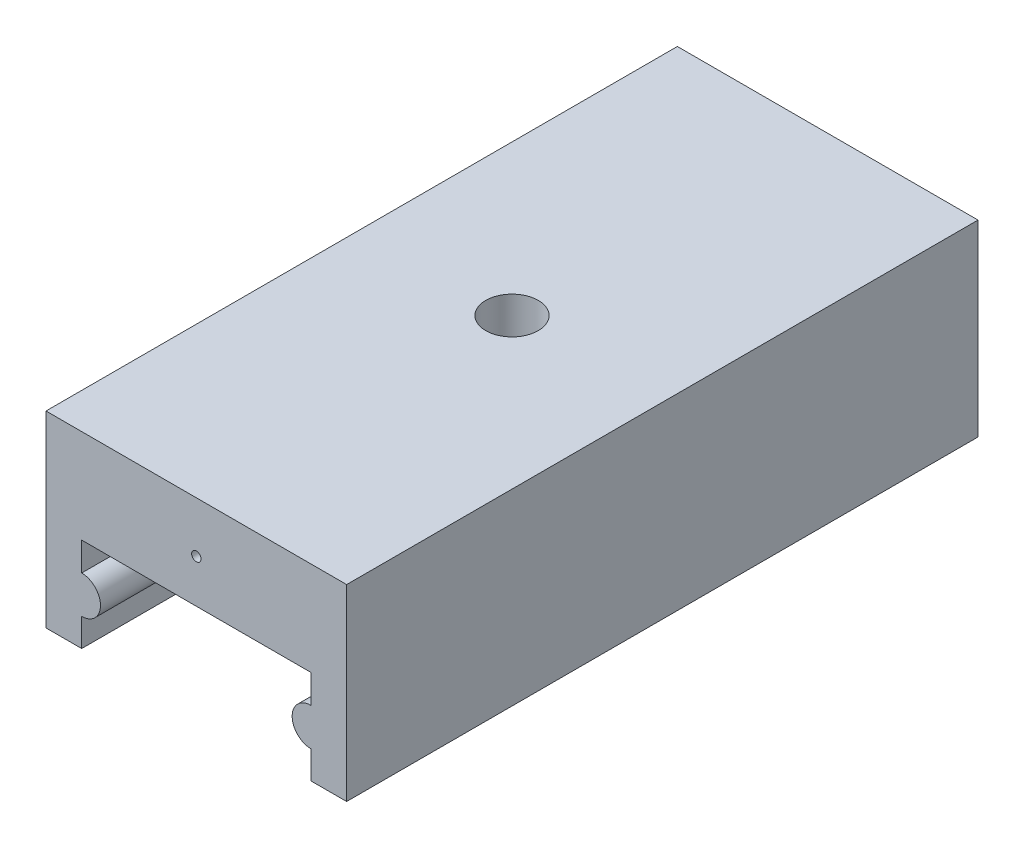
ISO-10303-21;
HEADER;
FILE_DESCRIPTION(('STEP AP214'),'2;1');
FILE_NAME('part.step','',(''),(''),'','','');
FILE_SCHEMA(('AUTOMOTIVE_DESIGN { 1 0 10303 214 1 1 1 1 }'));
ENDSEC;
DATA;
#1=APPLICATION_CONTEXT('core data for automotive mechanical design processes');
#2=APPLICATION_PROTOCOL_DEFINITION('international standard','automotive_design',2000,#1);
#3=PRODUCT_CONTEXT('',#1,'mechanical');
#4=PRODUCT('Part','Part','',(#3));
#5=PRODUCT_RELATED_PRODUCT_CATEGORY('part','',(#4));
#6=PRODUCT_DEFINITION_FORMATION('','',#4);
#7=PRODUCT_DEFINITION_CONTEXT('part definition',#1,'design');
#8=PRODUCT_DEFINITION('design','',#6,#7);
#9=PRODUCT_DEFINITION_SHAPE('','',#8);
#10=(LENGTH_UNIT() NAMED_UNIT(*) SI_UNIT(.MILLI.,.METRE.));
#11=(NAMED_UNIT(*) PLANE_ANGLE_UNIT() SI_UNIT($,.RADIAN.));
#12=(NAMED_UNIT(*) SI_UNIT($,.STERADIAN.) SOLID_ANGLE_UNIT());
#13=UNCERTAINTY_MEASURE_WITH_UNIT(LENGTH_MEASURE(1.E-05),#10,'distance_accuracy_value','');
#14=(GEOMETRIC_REPRESENTATION_CONTEXT(3) GLOBAL_UNCERTAINTY_ASSIGNED_CONTEXT((#13)) GLOBAL_UNIT_ASSIGNED_CONTEXT((#10,
#11,#12)) REPRESENTATION_CONTEXT('',''));
#15=CARTESIAN_POINT('',(0.,0.,0.));
#16=DIRECTION('',(0.,0.,1.));
#17=DIRECTION('',(1.,0.,0.));
#18=AXIS2_PLACEMENT_3D('',#15,#16,#17);
#19=CARTESIAN_POINT('',(-13.,13.,-16.8));
#20=DIRECTION('',(0.,-1.,0.));
#21=DIRECTION('',(-1.,0.,0.));
#22=AXIS2_PLACEMENT_3D('',#19,#20,#21);
#23=PLANE('',#22);
#24=CARTESIAN_POINT('',(0.,13.,0.));
#25=DIRECTION('',(0.,-1.,0.));
#26=DIRECTION('',(0.,0.,-1.));
#27=AXIS2_PLACEMENT_3D('',#24,#25,#26);
#28=CIRCLE('',#27,1.397);
#29=CARTESIAN_POINT('',(0.,13.,-1.397));
#30=VERTEX_POINT('',#29);
#31=EDGE_CURVE('E170',#30,#30,#28,.T.);
#32=ORIENTED_EDGE('',*,*,#31,.T.);
#33=EDGE_LOOP('',(#32));
#34=FACE_BOUND('',#33,.T.);
#35=DIRECTION('',(-1.,0.,0.));
#36=VECTOR('',#35,1.);
#37=CARTESIAN_POINT('',(-7.99999999999997,13.,16.8));
#38=LINE('',#37,#36);
#39=CARTESIAN_POINT('',(8.,13.,16.8));
#40=VERTEX_POINT('',#39);
#41=CARTESIAN_POINT('',(-7.99999999999997,13.,16.8));
#42=VERTEX_POINT('',#41);
#43=EDGE_CURVE('E160',#40,#42,#38,.T.);
#44=ORIENTED_EDGE('',*,*,#43,.F.);
#45=DIRECTION('',(0.,0.,1.));
#46=VECTOR('',#45,1.);
#47=CARTESIAN_POINT('',(8.,13.,-16.8));
#48=LINE('',#47,#46);
#49=CARTESIAN_POINT('',(8.,13.,-16.8));
#50=VERTEX_POINT('',#49);
#51=EDGE_CURVE('E247',#50,#40,#48,.T.);
#52=ORIENTED_EDGE('',*,*,#51,.F.);
#53=DIRECTION('',(-1.,0.,0.));
#54=VECTOR('',#53,1.);
#55=CARTESIAN_POINT('',(-7.99999999999997,13.,-16.8));
#56=LINE('',#55,#54);
#57=CARTESIAN_POINT('',(-7.99999999999997,13.,-16.8));
#58=VERTEX_POINT('',#57);
#59=EDGE_CURVE('E162',#50,#58,#56,.T.);
#60=ORIENTED_EDGE('',*,*,#59,.T.);
#61=DIRECTION('',(0.,0.,-1.));
#62=VECTOR('',#61,1.);
#63=CARTESIAN_POINT('',(-7.99999999999998,13.,-16.8));
#64=LINE('',#63,#62);
#65=EDGE_CURVE('E148',#42,#58,#64,.T.);
#66=ORIENTED_EDGE('',*,*,#65,.F.);
#67=EDGE_LOOP('',(#44,#52,#60,#66));
#68=FACE_BOUND('',#67,.T.);
#69=ADVANCED_FACE('F52',(#34,#68),#23,.F.);
#70=CARTESIAN_POINT('',(18.,8.,-16.8));
#71=DIRECTION('',(0.,0.,-1.));
#72=DIRECTION('',(-1.,0.,0.));
#73=AXIS2_PLACEMENT_3D('',#70,#71,#72);
#74=PLANE('',#73);
#75=DIRECTION('',(0.,-1.,0.));
#76=VECTOR('',#75,1.);
#77=CARTESIAN_POINT('',(6.10000000000002,8.,-16.8));
#78=LINE('',#77,#76);
#79=CARTESIAN_POINT('',(6.10000000000002,8.,-16.8));
#80=VERTEX_POINT('',#79);
#81=CARTESIAN_POINT('',(6.10000000000002,6.48253823913146,-16.8));
#82=VERTEX_POINT('',#81);
#83=EDGE_CURVE('E155',#80,#82,#78,.T.);
#84=ORIENTED_EDGE('',*,*,#83,.F.);
#85=DIRECTION('',(1.,0.,0.));
#86=VECTOR('',#85,1.);
#87=CARTESIAN_POINT('',(-5.6,8.,-16.8));
#88=LINE('',#87,#86);
#89=CARTESIAN_POINT('',(-6.09999999999997,8.,-16.8));
#90=VERTEX_POINT('',#89);
#91=EDGE_CURVE('E260',#90,#80,#88,.T.);
#92=ORIENTED_EDGE('',*,*,#91,.F.);
#93=DIRECTION('',(0.,1.,0.));
#94=VECTOR('',#93,1.);
#95=CARTESIAN_POINT('',(-6.09999999999997,8.,-16.8));
#96=LINE('',#95,#94);
#97=CARTESIAN_POINT('',(-6.09999999999997,6.48253823913146,-16.8));
#98=VERTEX_POINT('',#97);
#99=EDGE_CURVE('E229',#98,#90,#96,.T.);
#100=ORIENTED_EDGE('',*,*,#99,.F.);
#101=CARTESIAN_POINT('',(-6.09999999999997,5.48253823913146,-16.8));
#102=DIRECTION('',(0.,0.,-1.));
#103=DIRECTION('',(-1.,0.,0.));
#104=AXIS2_PLACEMENT_3D('',#101,#102,#103);
#105=CIRCLE('',#104,1.);
#106=CARTESIAN_POINT('',(-6.09999999999997,4.48253823913146,-16.8));
#107=VERTEX_POINT('',#106);
#108=EDGE_CURVE('E233',#107,#98,#105,.F.);
#109=ORIENTED_EDGE('',*,*,#108,.F.);
#110=DIRECTION('',(0.,1.,0.));
#111=VECTOR('',#110,1.);
#112=CARTESIAN_POINT('',(-6.09999999999997,8.,-16.8));
#113=LINE('',#112,#111);
#114=CARTESIAN_POINT('',(-6.09999999999997,3.,-16.8));
#115=VERTEX_POINT('',#114);
#116=EDGE_CURVE('E208',#115,#107,#113,.T.);
#117=ORIENTED_EDGE('',*,*,#116,.F.);
#118=DIRECTION('',(-1.,0.,0.));
#119=VECTOR('',#118,1.);
#120=CARTESIAN_POINT('',(13.,3.,-16.8));
#121=LINE('',#120,#119);
#122=CARTESIAN_POINT('',(-7.99999999999998,3.,-16.8));
#123=VERTEX_POINT('',#122);
#124=EDGE_CURVE('E68',#115,#123,#121,.T.);
#125=ORIENTED_EDGE('',*,*,#124,.T.);
#126=DIRECTION('',(0.,1.,0.));
#127=VECTOR('',#126,1.);
#128=CARTESIAN_POINT('',(-7.99999999999998,7.99999999999999,-16.8));
#129=LINE('',#128,#127);
#130=EDGE_CURVE('E164',#123,#58,#129,.T.);
#131=ORIENTED_EDGE('',*,*,#130,.T.);
#132=ORIENTED_EDGE('',*,*,#59,.F.);
#133=DIRECTION('',(0.,-1.,0.));
#134=VECTOR('',#133,1.);
#135=CARTESIAN_POINT('',(8.,7.99999999999999,-16.8));
#136=LINE('',#135,#134);
#137=CARTESIAN_POINT('',(8.,3.,-16.8));
#138=VERTEX_POINT('',#137);
#139=EDGE_CURVE('E243',#50,#138,#136,.T.);
#140=ORIENTED_EDGE('',*,*,#139,.T.);
#141=CARTESIAN_POINT('',(6.10000000000002,3.,-16.8));
#142=VERTEX_POINT('',#141);
#143=EDGE_CURVE('E279',#138,#142,#121,.T.);
#144=ORIENTED_EDGE('',*,*,#143,.T.);
#145=DIRECTION('',(0.,-1.,0.));
#146=VECTOR('',#145,1.);
#147=CARTESIAN_POINT('',(6.10000000000002,8.,-16.8));
#148=LINE('',#147,#146);
#149=CARTESIAN_POINT('',(6.10000000000002,4.48253823913146,-16.8));
#150=VERTEX_POINT('',#149);
#151=EDGE_CURVE('E226',#150,#142,#148,.T.);
#152=ORIENTED_EDGE('',*,*,#151,.F.);
#153=CARTESIAN_POINT('',(6.10000000000002,5.48253823913146,-16.8));
#154=DIRECTION('',(0.,0.,-1.));
#155=DIRECTION('',(-1.,0.,0.));
#156=AXIS2_PLACEMENT_3D('',#153,#154,#155);
#157=CIRCLE('',#156,1.);
#158=EDGE_CURVE('E236',#82,#150,#157,.F.);
#159=ORIENTED_EDGE('',*,*,#158,.F.);
#160=EDGE_LOOP('',(#84,#92,#100,#109,#117,#125,#131,#132,#140,#144,#152,#159));
#161=FACE_BOUND('',#160,.T.);
#162=CARTESIAN_POINT('',(0.,10.3,-16.8));
#163=DIRECTION('',(0.,0.,-1.));
#164=DIRECTION('',(-1.,0.,0.));
#165=AXIS2_PLACEMENT_3D('',#162,#163,#164);
#166=CIRCLE('',#165,0.25);
#167=CARTESIAN_POINT('',(-0.249999999999996,10.3,-16.8));
#168=VERTEX_POINT('',#167);
#169=EDGE_CURVE('E264',#168,#168,#166,.T.);
#170=ORIENTED_EDGE('',*,*,#169,.F.);
#171=EDGE_LOOP('',(#170));
#172=FACE_BOUND('',#171,.T.);
#173=ADVANCED_FACE('F324',(#161,#172),#74,.T.);
#174=CARTESIAN_POINT('',(18.,8.,16.8));
#175=DIRECTION('',(0.,0.,-1.));
#176=DIRECTION('',(-1.,0.,0.));
#177=AXIS2_PLACEMENT_3D('',#174,#175,#176);
#178=PLANE('',#177);
#179=CARTESIAN_POINT('',(0.,10.3,16.8));
#180=DIRECTION('',(0.,0.,-1.));
#181=DIRECTION('',(-1.,0.,0.));
#182=AXIS2_PLACEMENT_3D('',#179,#180,#181);
#183=CIRCLE('',#182,0.25);
#184=CARTESIAN_POINT('',(-0.249999999999983,10.3,16.8));
#185=VERTEX_POINT('',#184);
#186=EDGE_CURVE('E268',#185,#185,#183,.T.);
#187=ORIENTED_EDGE('',*,*,#186,.T.);
#188=EDGE_LOOP('',(#187));
#189=FACE_BOUND('',#188,.T.);
#190=DIRECTION('',(1.,0.,0.));
#191=VECTOR('',#190,1.);
#192=CARTESIAN_POINT('',(-5.59999999999998,8.,16.8));
#193=LINE('',#192,#191);
#194=CARTESIAN_POINT('',(-6.09999999999997,8.,16.8));
#195=VERTEX_POINT('',#194);
#196=CARTESIAN_POINT('',(6.10000000000002,8.,16.8));
#197=VERTEX_POINT('',#196);
#198=EDGE_CURVE('E257',#195,#197,#193,.T.);
#199=ORIENTED_EDGE('',*,*,#198,.T.);
#200=DIRECTION('',(0.,1.,0.));
#201=VECTOR('',#200,1.);
#202=CARTESIAN_POINT('',(6.10000000000002,8.,16.8));
#203=LINE('',#202,#201);
#204=CARTESIAN_POINT('',(6.10000000000002,6.48253823913146,16.8));
#205=VERTEX_POINT('',#204);
#206=EDGE_CURVE('E199',#205,#197,#203,.T.);
#207=ORIENTED_EDGE('',*,*,#206,.F.);
#208=CARTESIAN_POINT('',(6.10000000000002,5.48253823913146,16.8));
#209=DIRECTION('',(0.,0.,-1.));
#210=DIRECTION('',(-1.,0.,0.));
#211=AXIS2_PLACEMENT_3D('',#208,#209,#210);
#212=CIRCLE('',#211,1.);
#213=CARTESIAN_POINT('',(6.10000000000002,4.48253823913146,16.8));
#214=VERTEX_POINT('',#213);
#215=EDGE_CURVE('E195',#214,#205,#212,.T.);
#216=ORIENTED_EDGE('',*,*,#215,.F.);
#217=DIRECTION('',(0.,1.,0.));
#218=VECTOR('',#217,1.);
#219=CARTESIAN_POINT('',(6.10000000000002,4.48253823913146,16.8));
#220=LINE('',#219,#218);
#221=CARTESIAN_POINT('',(6.10000000000002,3.,16.8));
#222=VERTEX_POINT('',#221);
#223=EDGE_CURVE('E191',#222,#214,#220,.T.);
#224=ORIENTED_EDGE('',*,*,#223,.F.);
#225=DIRECTION('',(-1.,0.,0.));
#226=VECTOR('',#225,1.);
#227=CARTESIAN_POINT('',(13.,3.,16.8));
#228=LINE('',#227,#226);
#229=CARTESIAN_POINT('',(8.,3.,16.8));
#230=VERTEX_POINT('',#229);
#231=EDGE_CURVE('E283',#230,#222,#228,.T.);
#232=ORIENTED_EDGE('',*,*,#231,.F.);
#233=DIRECTION('',(0.,1.,0.));
#234=VECTOR('',#233,1.);
#235=CARTESIAN_POINT('',(8.,15.7161487389891,16.8));
#236=LINE('',#235,#234);
#237=EDGE_CURVE('E154',#230,#40,#236,.T.);
#238=ORIENTED_EDGE('',*,*,#237,.T.);
#239=ORIENTED_EDGE('',*,*,#43,.T.);
#240=DIRECTION('',(0.,-1.,0.));
#241=VECTOR('',#240,1.);
#242=CARTESIAN_POINT('',(-7.99999999999998,15.7161487389891,16.8));
#243=LINE('',#242,#241);
#244=CARTESIAN_POINT('',(-7.99999999999997,3.,16.8));
#245=VERTEX_POINT('',#244);
#246=EDGE_CURVE('E145',#42,#245,#243,.T.);
#247=ORIENTED_EDGE('',*,*,#246,.T.);
#248=CARTESIAN_POINT('',(-6.09999999999997,3.,16.8));
#249=VERTEX_POINT('',#248);
#250=EDGE_CURVE('E76',#249,#245,#228,.T.);
#251=ORIENTED_EDGE('',*,*,#250,.F.);
#252=DIRECTION('',(0.,-1.,0.));
#253=VECTOR('',#252,1.);
#254=CARTESIAN_POINT('',(-6.09999999999997,2.46843436217308,16.8));
#255=LINE('',#254,#253);
#256=CARTESIAN_POINT('',(-6.09999999999997,4.48253823913146,16.8));
#257=VERTEX_POINT('',#256);
#258=EDGE_CURVE('E188',#257,#249,#255,.T.);
#259=ORIENTED_EDGE('',*,*,#258,.F.);
#260=CARTESIAN_POINT('',(-6.09999999999997,5.48253823913146,16.8));
#261=DIRECTION('',(0.,0.,-1.));
#262=DIRECTION('',(1.,0.,0.));
#263=AXIS2_PLACEMENT_3D('',#260,#261,#262);
#264=CIRCLE('',#263,1.);
#265=CARTESIAN_POINT('',(-6.09999999999997,6.48253823913146,16.8));
#266=VERTEX_POINT('',#265);
#267=EDGE_CURVE('E184',#266,#257,#264,.T.);
#268=ORIENTED_EDGE('',*,*,#267,.F.);
#269=DIRECTION('',(0.,-1.,0.));
#270=VECTOR('',#269,1.);
#271=CARTESIAN_POINT('',(-6.09999999999997,6.48253823913146,16.8));
#272=LINE('',#271,#270);
#273=EDGE_CURVE('E174',#195,#266,#272,.T.);
#274=ORIENTED_EDGE('',*,*,#273,.F.);
#275=EDGE_LOOP('',(#199,#207,#216,#224,#232,#238,#239,#247,#251,#259,#268,#274));
#276=FACE_BOUND('',#275,.T.);
#277=ADVANCED_FACE('F166',(#189,#276),#178,.F.);
#278=CARTESIAN_POINT('',(13.,3.,-16.8));
#279=DIRECTION('',(0.,1.,0.));
#280=DIRECTION('',(1.,0.,0.));
#281=AXIS2_PLACEMENT_3D('',#278,#279,#280);
#282=PLANE('',#281);
#283=ORIENTED_EDGE('',*,*,#231,.T.);
#284=DIRECTION('',(0.,0.,-1.));
#285=VECTOR('',#284,1.);
#286=CARTESIAN_POINT('',(6.10000000000002,3.,-16.8));
#287=LINE('',#286,#285);
#288=EDGE_CURVE('E12',#222,#142,#287,.T.);
#289=ORIENTED_EDGE('',*,*,#288,.T.);
#290=ORIENTED_EDGE('',*,*,#143,.F.);
#291=DIRECTION('',(0.,0.,-1.));
#292=VECTOR('',#291,1.);
#293=CARTESIAN_POINT('',(8.,3.,-16.8));
#294=LINE('',#293,#292);
#295=EDGE_CURVE('E250',#230,#138,#294,.T.);
#296=ORIENTED_EDGE('',*,*,#295,.F.);
#297=EDGE_LOOP('',(#283,#289,#290,#296));
#298=FACE_BOUND('',#297,.T.);
#299=ADVANCED_FACE('F54',(#298),#282,.F.);
#300=ORIENTED_EDGE('',*,*,#124,.F.);
#301=DIRECTION('',(0.,0.,1.));
#302=VECTOR('',#301,1.);
#303=CARTESIAN_POINT('',(-6.09999999999997,3.,-16.8));
#304=LINE('',#303,#302);
#305=EDGE_CURVE('E61',#115,#249,#304,.T.);
#306=ORIENTED_EDGE('',*,*,#305,.T.);
#307=ORIENTED_EDGE('',*,*,#250,.T.);
#308=DIRECTION('',(0.,0.,1.));
#309=VECTOR('',#308,1.);
#310=CARTESIAN_POINT('',(-7.99999999999998,3.,-16.8));
#311=LINE('',#310,#309);
#312=EDGE_CURVE('E150',#123,#245,#311,.T.);
#313=ORIENTED_EDGE('',*,*,#312,.F.);
#314=EDGE_LOOP('',(#300,#306,#307,#313));
#315=FACE_BOUND('',#314,.T.);
#316=ADVANCED_FACE('F287',(#315),#282,.F.);
#317=CARTESIAN_POINT('',(0.,10.3,10.8));
#318=DIRECTION('',(0.,0.,1.));
#319=DIRECTION('',(1.,0.,0.));
#320=AXIS2_PLACEMENT_3D('',#317,#318,#319);
#321=CYLINDRICAL_SURFACE('',#320,0.25);
#322=CARTESIAN_POINT('',(0.,10.3,10.8));
#323=DIRECTION('',(0.,0.,-1.));
#324=DIRECTION('',(-1.,0.,0.));
#325=AXIS2_PLACEMENT_3D('',#322,#323,#324);
#326=CIRCLE('',#325,0.25);
#327=CARTESIAN_POINT('',(-0.249999999999986,10.3,10.8));
#328=VERTEX_POINT('',#327);
#329=EDGE_CURVE('E272',#328,#328,#326,.T.);
#330=ORIENTED_EDGE('',*,*,#329,.T.);
#331=EDGE_LOOP('',(#330));
#332=FACE_BOUND('',#331,.T.);
#333=ORIENTED_EDGE('',*,*,#186,.F.);
#334=EDGE_LOOP('',(#333));
#335=FACE_BOUND('',#334,.T.);
#336=ADVANCED_FACE('F349',(#332,#335),#321,.F.);
#337=CARTESIAN_POINT('',(0.,10.3,10.8));
#338=DIRECTION('',(0.,0.,-1.));
#339=DIRECTION('',(-1.,0.,0.));
#340=AXIS2_PLACEMENT_3D('',#337,#338,#339);
#341=PLANE('',#340);
#342=ORIENTED_EDGE('',*,*,#329,.F.);
#343=EDGE_LOOP('',(#342));
#344=FACE_BOUND('',#343,.T.);
#345=ADVANCED_FACE('F352',(#344),#341,.F.);
#346=CARTESIAN_POINT('',(0.,10.3,-16.8));
#347=DIRECTION('',(0.,0.,1.));
#348=DIRECTION('',(1.,0.,0.));
#349=AXIS2_PLACEMENT_3D('',#346,#347,#348);
#350=CYLINDRICAL_SURFACE('',#349,0.25);
#351=ORIENTED_EDGE('',*,*,#169,.T.);
#352=EDGE_LOOP('',(#351));
#353=FACE_BOUND('',#352,.T.);
#354=CARTESIAN_POINT('',(0.,10.3,-10.8));
#355=DIRECTION('',(0.,0.,-1.));
#356=DIRECTION('',(-1.,0.,0.));
#357=AXIS2_PLACEMENT_3D('',#354,#355,#356);
#358=CIRCLE('',#357,0.25);
#359=CARTESIAN_POINT('',(-0.249999999999994,10.3,-10.8));
#360=VERTEX_POINT('',#359);
#361=EDGE_CURVE('E263',#360,#360,#358,.T.);
#362=ORIENTED_EDGE('',*,*,#361,.F.);
#363=EDGE_LOOP('',(#362));
#364=FACE_BOUND('',#363,.T.);
#365=ADVANCED_FACE('F356',(#353,#364),#350,.F.);
#366=CARTESIAN_POINT('',(0.,10.3,-10.8));
#367=DIRECTION('',(0.,0.,-1.));
#368=DIRECTION('',(-1.,0.,0.));
#369=AXIS2_PLACEMENT_3D('',#366,#367,#368);
#370=PLANE('',#369);
#371=ORIENTED_EDGE('',*,*,#361,.T.);
#372=EDGE_LOOP('',(#371));
#373=FACE_BOUND('',#372,.T.);
#374=ADVANCED_FACE('F360',(#373),#370,.T.);
#375=CARTESIAN_POINT('',(-5.6,8.,-16.8));
#376=DIRECTION('',(0.,-1.,0.));
#377=DIRECTION('',(-1.,0.,0.));
#378=AXIS2_PLACEMENT_3D('',#375,#376,#377);
#379=PLANE('',#378);
#380=CARTESIAN_POINT('',(0.,8.,0.));
#381=DIRECTION('',(0.,-1.,0.));
#382=DIRECTION('',(0.,0.,-1.));
#383=AXIS2_PLACEMENT_3D('',#380,#381,#382);
#384=CIRCLE('',#383,3.61188);
#385=CARTESIAN_POINT('',(0.,8.,-3.61188));
#386=VERTEX_POINT('',#385);
#387=EDGE_CURVE('E403',#386,#386,#384,.T.);
#388=ORIENTED_EDGE('',*,*,#387,.F.);
#389=EDGE_LOOP('',(#388));
#390=FACE_BOUND('',#389,.T.);
#391=ORIENTED_EDGE('',*,*,#198,.F.);
#392=DIRECTION('',(0.,0.,1.));
#393=VECTOR('',#392,1.);
#394=CARTESIAN_POINT('',(-6.09999999999997,8.,-37.2));
#395=LINE('',#394,#393);
#396=EDGE_CURVE('E203',#90,#195,#395,.T.);
#397=ORIENTED_EDGE('',*,*,#396,.F.);
#398=ORIENTED_EDGE('',*,*,#91,.T.);
#399=DIRECTION('',(0.,0.,1.));
#400=VECTOR('',#399,1.);
#401=CARTESIAN_POINT('',(6.10000000000002,8.,-37.2));
#402=LINE('',#401,#400);
#403=EDGE_CURVE('E204',#80,#197,#402,.T.);
#404=ORIENTED_EDGE('',*,*,#403,.T.);
#405=EDGE_LOOP('',(#391,#397,#398,#404));
#406=FACE_BOUND('',#405,.T.);
#407=ADVANCED_FACE('F308',(#390,#406),#379,.T.);
#408=CARTESIAN_POINT('',(8.,15.7161487389891,-29.2));
#409=DIRECTION('',(1.,0.,0.));
#410=DIRECTION('',(0.,1.,0.));
#411=AXIS2_PLACEMENT_3D('',#408,#409,#410);
#412=PLANE('',#411);
#413=ORIENTED_EDGE('',*,*,#139,.F.);
#414=ORIENTED_EDGE('',*,*,#51,.T.);
#415=ORIENTED_EDGE('',*,*,#237,.F.);
#416=ORIENTED_EDGE('',*,*,#295,.T.);
#417=EDGE_LOOP('',(#413,#414,#415,#416));
#418=FACE_BOUND('',#417,.T.);
#419=ADVANCED_FACE('F323',(#418),#412,.T.);
#420=CARTESIAN_POINT('',(-7.99999999999998,15.7161487389891,-29.2));
#421=DIRECTION('',(-1.,0.,0.));
#422=DIRECTION('',(0.,-1.,0.));
#423=AXIS2_PLACEMENT_3D('',#420,#421,#422);
#424=PLANE('',#423);
#425=ORIENTED_EDGE('',*,*,#246,.F.);
#426=ORIENTED_EDGE('',*,*,#65,.T.);
#427=ORIENTED_EDGE('',*,*,#130,.F.);
#428=ORIENTED_EDGE('',*,*,#312,.T.);
#429=EDGE_LOOP('',(#425,#426,#427,#428));
#430=FACE_BOUND('',#429,.T.);
#431=ADVANCED_FACE('F147',(#430),#424,.T.);
#432=CARTESIAN_POINT('',(6.10000000000002,4.48253823913146,-37.2));
#433=DIRECTION('',(1.,0.,0.));
#434=DIRECTION('',(0.,0.,-1.));
#435=AXIS2_PLACEMENT_3D('',#432,#433,#434);
#436=PLANE('',#435);
#437=ORIENTED_EDGE('',*,*,#151,.T.);
#438=ORIENTED_EDGE('',*,*,#288,.F.);
#439=ORIENTED_EDGE('',*,*,#223,.T.);
#440=DIRECTION('',(0.,0.,1.));
#441=VECTOR('',#440,1.);
#442=CARTESIAN_POINT('',(6.10000000000002,4.48253823913146,-37.2));
#443=LINE('',#442,#441);
#444=EDGE_CURVE('E212',#150,#214,#443,.T.);
#445=ORIENTED_EDGE('',*,*,#444,.F.);
#446=EDGE_LOOP('',(#437,#438,#439,#445));
#447=FACE_BOUND('',#446,.T.);
#448=ADVANCED_FACE('F327',(#447),#436,.F.);
#449=CARTESIAN_POINT('',(6.10000000000002,5.48253823913146,-37.2));
#450=DIRECTION('',(0.,0.,1.));
#451=DIRECTION('',(1.,0.,0.));
#452=AXIS2_PLACEMENT_3D('',#449,#450,#451);
#453=CYLINDRICAL_SURFACE('',#452,1.);
#454=ORIENTED_EDGE('',*,*,#158,.T.);
#455=ORIENTED_EDGE('',*,*,#444,.T.);
#456=ORIENTED_EDGE('',*,*,#215,.T.);
#457=DIRECTION('',(0.,0.,1.));
#458=VECTOR('',#457,1.);
#459=CARTESIAN_POINT('',(6.10000000000002,6.48253823913146,-37.2));
#460=LINE('',#459,#458);
#461=EDGE_CURVE('E209',#82,#205,#460,.T.);
#462=ORIENTED_EDGE('',*,*,#461,.F.);
#463=EDGE_LOOP('',(#454,#455,#456,#462));
#464=FACE_BOUND('',#463,.T.);
#465=ADVANCED_FACE('F315',(#464),#453,.T.);
#466=CARTESIAN_POINT('',(6.10000000000002,8.,-37.2));
#467=DIRECTION('',(1.,0.,0.));
#468=DIRECTION('',(0.,0.,-1.));
#469=AXIS2_PLACEMENT_3D('',#466,#467,#468);
#470=PLANE('',#469);
#471=ORIENTED_EDGE('',*,*,#83,.T.);
#472=ORIENTED_EDGE('',*,*,#461,.T.);
#473=ORIENTED_EDGE('',*,*,#206,.T.);
#474=ORIENTED_EDGE('',*,*,#403,.F.);
#475=EDGE_LOOP('',(#471,#472,#473,#474));
#476=FACE_BOUND('',#475,.T.);
#477=ADVANCED_FACE('F311',(#476),#470,.F.);
#478=CARTESIAN_POINT('',(-6.09999999999997,2.46843436217308,-37.2));
#479=DIRECTION('',(-1.,0.,0.));
#480=DIRECTION('',(0.,0.,1.));
#481=AXIS2_PLACEMENT_3D('',#478,#479,#480);
#482=PLANE('',#481);
#483=ORIENTED_EDGE('',*,*,#116,.T.);
#484=DIRECTION('',(0.,0.,1.));
#485=VECTOR('',#484,1.);
#486=CARTESIAN_POINT('',(-6.09999999999997,4.48253823913146,-37.2));
#487=LINE('',#486,#485);
#488=EDGE_CURVE('E215',#107,#257,#487,.T.);
#489=ORIENTED_EDGE('',*,*,#488,.T.);
#490=ORIENTED_EDGE('',*,*,#258,.T.);
#491=ORIENTED_EDGE('',*,*,#305,.F.);
#492=EDGE_LOOP('',(#483,#489,#490,#491));
#493=FACE_BOUND('',#492,.T.);
#494=ADVANCED_FACE('F294',(#493),#482,.F.);
#495=CARTESIAN_POINT('',(-6.09999999999997,5.48253823913146,-37.2));
#496=DIRECTION('',(0.,0.,1.));
#497=DIRECTION('',(1.,0.,0.));
#498=AXIS2_PLACEMENT_3D('',#495,#496,#497);
#499=CYLINDRICAL_SURFACE('',#498,1.);
#500=ORIENTED_EDGE('',*,*,#108,.T.);
#501=DIRECTION('',(0.,0.,1.));
#502=VECTOR('',#501,1.);
#503=CARTESIAN_POINT('',(-6.09999999999997,6.48253823913146,-37.2));
#504=LINE('',#503,#502);
#505=EDGE_CURVE('E218',#98,#266,#504,.T.);
#506=ORIENTED_EDGE('',*,*,#505,.T.);
#507=ORIENTED_EDGE('',*,*,#267,.T.);
#508=ORIENTED_EDGE('',*,*,#488,.F.);
#509=EDGE_LOOP('',(#500,#506,#507,#508));
#510=FACE_BOUND('',#509,.T.);
#511=ADVANCED_FACE('F298',(#510),#499,.T.);
#512=CARTESIAN_POINT('',(-6.09999999999997,6.48253823913146,-37.2));
#513=DIRECTION('',(-1.,0.,0.));
#514=DIRECTION('',(0.,0.,1.));
#515=AXIS2_PLACEMENT_3D('',#512,#513,#514);
#516=PLANE('',#515);
#517=ORIENTED_EDGE('',*,*,#99,.T.);
#518=ORIENTED_EDGE('',*,*,#396,.T.);
#519=ORIENTED_EDGE('',*,*,#273,.T.);
#520=ORIENTED_EDGE('',*,*,#505,.F.);
#521=EDGE_LOOP('',(#517,#518,#519,#520));
#522=FACE_BOUND('',#521,.T.);
#523=ADVANCED_FACE('F302',(#522),#516,.F.);
#524=CARTESIAN_POINT('',(0.,8.,0.));
#525=DIRECTION('',(0.,-1.,0.));
#526=DIRECTION('',(0.,0.,-1.));
#527=AXIS2_PLACEMENT_3D('',#524,#525,#526);
#528=CYLINDRICAL_SURFACE('',#527,1.397);
#529=ORIENTED_EDGE('',*,*,#31,.F.);
#530=EDGE_LOOP('',(#529));
#531=FACE_BOUND('',#530,.T.);
#532=CARTESIAN_POINT('',(0.,9.4986,0.));
#533=DIRECTION('',(0.,-1.,0.));
#534=DIRECTION('',(0.,0.,-1.));
#535=AXIS2_PLACEMENT_3D('',#532,#533,#534);
#536=CIRCLE('',#535,1.397);
#537=CARTESIAN_POINT('',(0.,9.4986,-1.397));
#538=VERTEX_POINT('',#537);
#539=EDGE_CURVE('E177',#538,#538,#536,.T.);
#540=ORIENTED_EDGE('',*,*,#539,.T.);
#541=EDGE_LOOP('',(#540));
#542=FACE_BOUND('',#541,.T.);
#543=ADVANCED_FACE('F371',(#531,#542),#528,.F.);
#544=CARTESIAN_POINT('',(2.97688,9.4986,0.));
#545=DIRECTION('',(0.,1.,0.));
#546=DIRECTION('',(0.,0.,1.));
#547=AXIS2_PLACEMENT_3D('',#544,#545,#546);
#548=PLANE('',#547);
#549=ORIENTED_EDGE('',*,*,#539,.F.);
#550=EDGE_LOOP('',(#549));
#551=FACE_BOUND('',#550,.T.);
#552=CARTESIAN_POINT('',(0.,9.4986,0.));
#553=DIRECTION('',(0.,-1.,0.));
#554=DIRECTION('',(0.,0.,-1.));
#555=AXIS2_PLACEMENT_3D('',#552,#553,#554);
#556=CIRCLE('',#555,2.97688);
#557=CARTESIAN_POINT('',(0.,9.4986,-2.97688));
#558=VERTEX_POINT('',#557);
#559=EDGE_CURVE('E407',#558,#558,#556,.T.);
#560=ORIENTED_EDGE('',*,*,#559,.T.);
#561=EDGE_LOOP('',(#560));
#562=FACE_BOUND('',#561,.T.);
#563=ADVANCED_FACE('F383',(#551,#562),#548,.F.);
#564=CARTESIAN_POINT('',(0.,8.,0.));
#565=DIRECTION('',(0.,-1.,0.));
#566=DIRECTION('',(0.,0.,-1.));
#567=AXIS2_PLACEMENT_3D('',#564,#565,#566);
#568=CYLINDRICAL_SURFACE('',#567,2.97688);
#569=ORIENTED_EDGE('',*,*,#559,.F.);
#570=EDGE_LOOP('',(#569));
#571=FACE_BOUND('',#570,.T.);
#572=CARTESIAN_POINT('',(0.,8.635,0.));
#573=DIRECTION('',(0.,-1.,0.));
#574=DIRECTION('',(0.,0.,-1.));
#575=AXIS2_PLACEMENT_3D('',#572,#573,#574);
#576=CIRCLE('',#575,2.97688);
#577=CARTESIAN_POINT('',(0.,8.635,-2.97688));
#578=VERTEX_POINT('',#577);
#579=EDGE_CURVE('E400',#578,#578,#576,.T.);
#580=ORIENTED_EDGE('',*,*,#579,.T.);
#581=EDGE_LOOP('',(#580));
#582=FACE_BOUND('',#581,.T.);
#583=ADVANCED_FACE('F387',(#571,#582),#568,.F.);
#584=CARTESIAN_POINT('',(0.,8.,0.));
#585=DIRECTION('',(0.,-1.,0.));
#586=DIRECTION('',(0.,0.,-1.));
#587=AXIS2_PLACEMENT_3D('',#584,#585,#586);
#588=CONICAL_SURFACE('',#587,3.61188,0.785398163397448);
#589=ORIENTED_EDGE('',*,*,#579,.F.);
#590=EDGE_LOOP('',(#589));
#591=FACE_BOUND('',#590,.T.);
#592=ORIENTED_EDGE('',*,*,#387,.T.);
#593=EDGE_LOOP('',(#592));
#594=FACE_BOUND('',#593,.T.);
#595=ADVANCED_FACE('F391',(#591,#594),#588,.F.);
#596=CLOSED_SHELL('',(#69,#173,#277,#299,#316,#336,#345,#365,#374,#407,#419,#431,#448,#465,#477,
#494,#511,#523,#543,#563,#583,#595));
#597=MANIFOLD_SOLID_BREP('B2',#596);
#598=ADVANCED_BREP_SHAPE_REPRESENTATION('',(#18,#597),#14);
#599=SHAPE_DEFINITION_REPRESENTATION(#9,#598);
ENDSEC;
END-ISO-10303-21;
